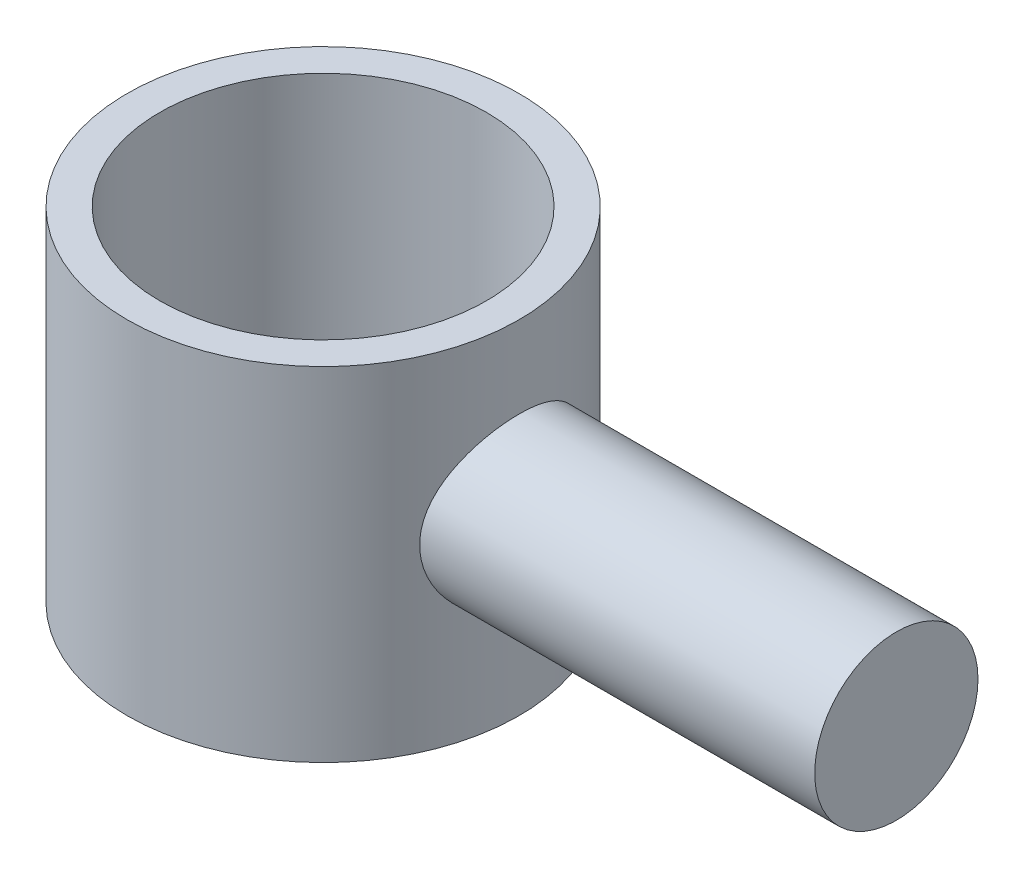
ISO-10303-21;
HEADER;
FILE_DESCRIPTION(('STEP AP214'),'2;1');
FILE_NAME('part.step','',(''),(''),'','','');
FILE_SCHEMA(('AUTOMOTIVE_DESIGN { 1 0 10303 214 1 1 1 1 }'));
ENDSEC;
DATA;
#1=APPLICATION_CONTEXT('core data for automotive mechanical design processes');
#2=APPLICATION_PROTOCOL_DEFINITION('international standard','automotive_design',2000,#1);
#3=PRODUCT_CONTEXT('',#1,'mechanical');
#4=PRODUCT('Part','Part','',(#3));
#5=PRODUCT_RELATED_PRODUCT_CATEGORY('part','',(#4));
#6=PRODUCT_DEFINITION_FORMATION('','',#4);
#7=PRODUCT_DEFINITION_CONTEXT('part definition',#1,'design');
#8=PRODUCT_DEFINITION('design','',#6,#7);
#9=PRODUCT_DEFINITION_SHAPE('','',#8);
#10=(LENGTH_UNIT() NAMED_UNIT(*) SI_UNIT(.MILLI.,.METRE.));
#11=(NAMED_UNIT(*) PLANE_ANGLE_UNIT() SI_UNIT($,.RADIAN.));
#12=(NAMED_UNIT(*) SI_UNIT($,.STERADIAN.) SOLID_ANGLE_UNIT());
#13=UNCERTAINTY_MEASURE_WITH_UNIT(LENGTH_MEASURE(1.E-05),#10,'distance_accuracy_value','');
#14=(GEOMETRIC_REPRESENTATION_CONTEXT(3) GLOBAL_UNCERTAINTY_ASSIGNED_CONTEXT((#13)) GLOBAL_UNIT_ASSIGNED_CONTEXT((#10,
#11,#12)) REPRESENTATION_CONTEXT('',''));
#15=CARTESIAN_POINT('',(0.,0.,0.));
#16=DIRECTION('',(0.,0.,1.));
#17=DIRECTION('',(1.,0.,0.));
#18=AXIS2_PLACEMENT_3D('',#15,#16,#17);
#19=CARTESIAN_POINT('',(0.,210.,0.));
#20=DIRECTION('',(0.,1.,0.));
#21=DIRECTION('',(0.,0.,1.));
#22=AXIS2_PLACEMENT_3D('',#19,#20,#21);
#23=PLANE('',#22);
#24=CARTESIAN_POINT('',(0.,210.,0.));
#25=DIRECTION('',(0.,1.,0.));
#26=DIRECTION('',(0.,0.,1.));
#27=AXIS2_PLACEMENT_3D('',#24,#25,#26);
#28=CIRCLE('',#27,120.);
#29=CARTESIAN_POINT('',(0.,210.,120.));
#30=VERTEX_POINT('',#29);
#31=EDGE_CURVE('E10',#30,#30,#28,.T.);
#32=ORIENTED_EDGE('',*,*,#31,.T.);
#33=EDGE_LOOP('',(#32));
#34=FACE_BOUND('',#33,.T.);
#35=CARTESIAN_POINT('',(0.,210.,0.));
#36=DIRECTION('',(0.,1.,0.));
#37=DIRECTION('',(0.,0.,1.));
#38=AXIS2_PLACEMENT_3D('',#35,#36,#37);
#39=CIRCLE('',#38,100.);
#40=CARTESIAN_POINT('',(0.,210.,100.));
#41=VERTEX_POINT('',#40);
#42=EDGE_CURVE('E42',#41,#41,#39,.T.);
#43=ORIENTED_EDGE('',*,*,#42,.F.);
#44=EDGE_LOOP('',(#43));
#45=FACE_BOUND('',#44,.T.);
#46=ADVANCED_FACE('F31',(#34,#45),#23,.T.);
#47=CARTESIAN_POINT('',(0.,0.,0.));
#48=DIRECTION('',(0.,1.,0.));
#49=DIRECTION('',(0.,0.,1.));
#50=AXIS2_PLACEMENT_3D('',#47,#48,#49);
#51=PLANE('',#50);
#52=CARTESIAN_POINT('',(0.,0.,0.));
#53=DIRECTION('',(0.,1.,0.));
#54=DIRECTION('',(0.,0.,1.));
#55=AXIS2_PLACEMENT_3D('',#52,#53,#54);
#56=CIRCLE('',#55,120.);
#57=CARTESIAN_POINT('',(0.,0.,120.));
#58=VERTEX_POINT('',#57);
#59=EDGE_CURVE('E35',#58,#58,#56,.T.);
#60=ORIENTED_EDGE('',*,*,#59,.F.);
#61=EDGE_LOOP('',(#60));
#62=FACE_BOUND('',#61,.T.);
#63=CARTESIAN_POINT('',(0.,0.,0.));
#64=DIRECTION('',(0.,1.,0.));
#65=DIRECTION('',(0.,0.,1.));
#66=AXIS2_PLACEMENT_3D('',#63,#64,#65);
#67=CIRCLE('',#66,100.);
#68=CARTESIAN_POINT('',(0.,0.,100.));
#69=VERTEX_POINT('',#68);
#70=EDGE_CURVE('E44',#69,#69,#67,.T.);
#71=ORIENTED_EDGE('',*,*,#70,.T.);
#72=EDGE_LOOP('',(#71));
#73=FACE_BOUND('',#72,.T.);
#74=ADVANCED_FACE('F73',(#62,#73),#51,.F.);
#75=CARTESIAN_POINT('',(0.,210.,0.));
#76=DIRECTION('',(0.,-1.,0.));
#77=DIRECTION('',(0.,0.,-1.));
#78=AXIS2_PLACEMENT_3D('',#75,#76,#77);
#79=CYLINDRICAL_SURFACE('',#78,120.);
#80=CARTESIAN_POINT('',(109.087121146357,110.,-50.));
#81=CARTESIAN_POINT('',(109.087121769528,110.667082917127,-49.9999994006115));
#82=CARTESIAN_POINT('',(109.09324519041,111.33419491938,-49.9866456959213));
#83=CARTESIAN_POINT('',(109.117687498157,112.66719794343,-49.9332665097033));
#84=CARTESIAN_POINT('',(109.136008027321,113.333088788694,-49.8932374364281));
#85=CARTESIAN_POINT('',(109.184701284633,114.662667195908,-49.7865894408554));
#86=CARTESIAN_POINT('',(109.215080432607,115.326353394044,-49.7199563548768));
#87=CARTESIAN_POINT('',(109.287622123923,116.649915832098,-49.5602983560333));
#88=CARTESIAN_POINT('',(109.329785823572,117.309791691655,-49.4672708533208));
#89=CARTESIAN_POINT('',(109.473668018017,119.284871583528,-49.1484655385415));
#90=CARTESIAN_POINT('',(109.592671212671,120.592682865512,-48.8831938995374));
#91=CARTESIAN_POINT('',(109.872736811669,123.178419739598,-48.2503980287102));
#92=CARTESIAN_POINT('',(110.033792729632,124.456349907592,-47.8828895657332));
#93=CARTESIAN_POINT('',(110.302642601984,126.341932503159,-47.2586257147939));
#94=CARTESIAN_POINT('',(110.396596134671,126.96407061308,-47.0388649108351));
#95=CARTESIAN_POINT('',(110.592932415297,128.198007379557,-46.5753875898117));
#96=CARTESIAN_POINT('',(110.695314706099,128.809806594683,-46.3316723717859));
#97=CARTESIAN_POINT('',(110.907754443794,130.022142321009,-45.8208085682801));
#98=CARTESIAN_POINT('',(111.017811508094,130.622679391746,-45.5536611507408));
#99=CARTESIAN_POINT('',(111.244835501407,131.811790744278,-44.9964119819212));
#100=CARTESIAN_POINT('',(111.361803855889,132.400362524322,-44.7063054910614));
#101=CARTESIAN_POINT('',(111.721724726272,134.14621390764,-43.8027019897478));
#102=CARTESIAN_POINT('',(111.973834408944,135.284426399529,-43.1555846714791));
#103=CARTESIAN_POINT('',(112.495747715835,137.50376640175,-41.7761920720391));
#104=CARTESIAN_POINT('',(112.765552414296,138.584890439107,-41.0439116186282));
#105=CARTESIAN_POINT('',(113.186184657094,140.189386164944,-39.8632083841146));
#106=CARTESIAN_POINT('',(113.333113731648,140.735338779977,-39.4437875879487));
#107=CARTESIAN_POINT('',(113.628986027598,141.809003307401,-38.5831646328386));
#108=CARTESIAN_POINT('',(113.777928770647,142.336719449517,-38.1419675830619));
#109=CARTESIAN_POINT('',(114.226378322529,143.891751467901,-36.7864112913372));
#110=CARTESIAN_POINT('',(114.527522313782,144.891010774006,-35.8400428520047));
#111=CARTESIAN_POINT('',(115.126303631339,146.808917898417,-33.8673472079906));
#112=CARTESIAN_POINT('',(115.423939618339,147.727535740371,-32.8409905351638));
#113=CARTESIAN_POINT('',(116.008038807986,149.478426712813,-30.7140199806887));
#114=CARTESIAN_POINT('',(116.294501820334,150.310698373052,-29.61340483514));
#115=CARTESIAN_POINT('',(116.861000337347,151.917576754926,-27.2945415496215));
#116=CARTESIAN_POINT('',(117.140214753528,152.688102541377,-26.0732594100613));
#117=CARTESIAN_POINT('',(117.670672213187,154.122914260075,-23.5638976589295));
#118=CARTESIAN_POINT('',(117.921914212891,154.787196228304,-22.2758155573863));
#119=CARTESIAN_POINT('',(118.389116558075,156.003239743665,-19.6419221722076));
#120=CARTESIAN_POINT('',(118.605089094586,156.555040186931,-18.296131039877));
#121=CARTESIAN_POINT('',(118.995456182529,157.540757359729,-15.5562083787796));
#122=CARTESIAN_POINT('',(119.169853644244,157.97468234092,-14.1620802414654));
#123=CARTESIAN_POINT('',(119.463913670798,158.700419050197,-11.4099852775746));
#124=CARTESIAN_POINT('',(119.585951989266,158.998450275148,-10.0539110870166));
#125=CARTESIAN_POINT('',(119.784477516877,159.481002007775,-7.31840821908095));
#126=CARTESIAN_POINT('',(119.860966171812,159.665526118288,-5.9389802844042));
#127=CARTESIAN_POINT('',(119.966178251465,159.918906408815,-3.16820361222309));
#128=CARTESIAN_POINT('',(119.994918152034,159.987802486715,-1.77685915318786));
#129=CARTESIAN_POINT('',(120.003846629651,160.009232952984,1.00685701848677));
#130=CARTESIAN_POINT('',(119.984037087776,159.961771849679,2.3992286892366));
#131=CARTESIAN_POINT('',(119.89912925188,159.757501939605,5.08900073600678));
#132=CARTESIAN_POINT('',(119.836864836411,159.607534040523,6.38701718367507));
#133=CARTESIAN_POINT('',(119.671638755241,159.207056444437,8.9647484248935));
#134=CARTESIAN_POINT('',(119.568679062838,158.956551622421,10.2444641027237));
#135=CARTESIAN_POINT('',(119.324627217543,158.357433934823,12.7770088104346));
#136=CARTESIAN_POINT('',(119.183533730254,158.008817636057,14.0298368977948));
#137=CARTESIAN_POINT('',(118.866655590133,157.216665484081,16.5005965178014));
#138=CARTESIAN_POINT('',(118.690869907844,156.773126814109,17.7185270136676));
#139=CARTESIAN_POINT('',(118.305877393294,155.787438637813,20.1304110467038));
#140=CARTESIAN_POINT('',(118.09620305675,155.243892369262,21.323718490677));
#141=CARTESIAN_POINT('',(117.650395909933,154.067131162857,23.6600683179743));
#142=CARTESIAN_POINT('',(117.414263034049,153.433916002645,24.8031105766428));
#143=CARTESIAN_POINT('',(116.92096708355,152.082164789256,27.0331694436863));
#144=CARTESIAN_POINT('',(116.663798156783,151.363604968205,28.120170323503));
#145=CARTESIAN_POINT('',(116.134309222195,149.845746705242,30.2325605530462));
#146=CARTESIAN_POINT('',(115.861988540637,149.04644467177,31.2579471588185));
#147=CARTESIAN_POINT('',(115.437089677084,147.761097522874,32.7808274312132));
#148=CARTESIAN_POINT('',(115.287661829708,147.30204968881,33.3022426910627));
#149=CARTESIAN_POINT('',(114.987220509682,146.362877083827,34.3252558845501));
#150=CARTESIAN_POINT('',(114.836207122697,145.882753447198,34.8268548819355));
#151=CARTESIAN_POINT('',(114.533589887552,144.902158649407,35.8095112439988));
#152=CARTESIAN_POINT('',(114.38198607131,144.401688574689,36.2905697026819));
#153=CARTESIAN_POINT('',(114.079153128978,143.38099449936,37.2315893744054));
#154=CARTESIAN_POINT('',(113.927924105653,142.860765608137,37.6915453012193));
#155=CARTESIAN_POINT('',(113.476294290158,141.271414427361,39.0387975803172));
#156=CARTESIAN_POINT('',(113.177969303577,140.173687121626,39.8934188193535));
#157=CARTESIAN_POINT('',(112.595198227224,137.90835121015,41.5097557086326));
#158=CARTESIAN_POINT('',(112.310751825223,136.740744177823,42.2714734495224));
#159=CARTESIAN_POINT('',(111.89616170449,134.92218186826,43.3520982886109));
#160=CARTESIAN_POINT('',(111.757886403629,134.294268463083,43.707089161853));
#161=CARTESIAN_POINT('',(111.488361376018,133.022611693511,44.3900892965016));
#162=CARTESIAN_POINT('',(111.357109986666,132.378872128385,44.7181049530595));
#163=CARTESIAN_POINT('',(111.102682074021,131.076381681106,45.3465435853707));
#164=CARTESIAN_POINT('',(110.979506616202,130.417628833609,45.6469629223769));
#165=CARTESIAN_POINT('',(110.742303924656,129.086311090848,46.2194549378673));
#166=CARTESIAN_POINT('',(110.628277247555,128.41374535831,46.4915258918943));
#167=CARTESIAN_POINT('',(110.301607799027,126.377913059927,47.2638198879434));
#168=CARTESIAN_POINT('',(110.1041515029,124.995378601925,47.720671187167));
#169=CARTESIAN_POINT('',(109.757311414267,122.190332273652,48.5130917244921));
#170=CARTESIAN_POINT('',(109.607923342925,120.767823973954,48.8486717579943));
#171=CARTESIAN_POINT('',(109.370974289154,117.987608202323,49.3767973601833));
#172=CARTESIAN_POINT('',(109.280030760112,116.631684496404,49.5772105065307));
#173=CARTESIAN_POINT('',(109.148523409333,113.905548366324,49.8660734477577));
#174=CARTESIAN_POINT('',(109.107957383908,112.535336569817,49.9545281400964));
#175=CARTESIAN_POINT('',(109.078699303147,109.792141981501,50.0183824093745));
#176=CARTESIAN_POINT('',(109.089991666683,108.419160145876,49.993815944115));
#177=CARTESIAN_POINT('',(109.16399975697,105.681282928765,49.832008510742));
#178=CARTESIAN_POINT('',(109.22671394721,104.316387306885,49.6947709093013));
#179=CARTESIAN_POINT('',(109.395655290867,101.692624987564,49.3216919740965));
#180=CARTESIAN_POINT('',(109.498833294051,100.432572996313,49.0927401811814));
#181=CARTESIAN_POINT('',(109.744987943453,97.9375136713739,48.5399738507507));
#182=CARTESIAN_POINT('',(109.887962529282,96.7025050446646,48.2161642242656));
#183=CARTESIAN_POINT('',(110.209496685317,94.2649002922232,47.4766173592912));
#184=CARTESIAN_POINT('',(110.388062243849,93.0623096596593,47.0608646497105));
#185=CARTESIAN_POINT('',(110.775722713844,90.6965565717083,46.1409605641787));
#186=CARTESIAN_POINT('',(110.984819061523,89.5333959743455,45.6368050293951));
#187=CARTESIAN_POINT('',(111.437389904751,87.2041345263877,44.5206215159839));
#188=CARTESIAN_POINT('',(111.681944701202,86.0399919037659,43.9049316783573));
#189=CARTESIAN_POINT('',(112.064044675229,84.3356851871716,42.9159028588744));
#190=CARTESIAN_POINT('',(112.193963380304,83.7745383565725,42.5752907759561));
#191=CARTESIAN_POINT('',(112.458087297168,82.6666726954793,41.872658437913));
#192=CARTESIAN_POINT('',(112.592293377426,82.1199568296772,41.5106338325587));
#193=CARTESIAN_POINT('',(113.000078391157,80.5024313190313,40.39320579798));
#194=CARTESIAN_POINT('',(113.278805991703,79.4543236455156,39.6064945479185));
#195=CARTESIAN_POINT('',(113.843037074605,77.424114287287,37.9542455349877));
#196=CARTESIAN_POINT('',(114.128540854264,76.442015505968,37.0887043087289));
#197=CARTESIAN_POINT('',(114.568397194061,74.9834909431515,35.6979645360249));
#198=CARTESIAN_POINT('',(114.72278778284,74.4819015249335,35.1989370316959));
#199=CARTESIAN_POINT('',(115.030476598339,73.5003055775859,34.1800043422734));
#200=CARTESIAN_POINT('',(115.18377505945,73.0202942922613,33.6601038062615));
#201=CARTESIAN_POINT('',(115.640560598636,71.6134605214889,32.0698689435435));
#202=CARTESIAN_POINT('',(115.940953531044,70.7197866107023,30.9689522454499));
#203=CARTESIAN_POINT('',(116.525237504847,69.0273008271619,28.6923419533714));
#204=CARTESIAN_POINT('',(116.809126809914,68.2284989265885,27.5166405185278));
#205=CARTESIAN_POINT('',(117.352716450828,66.7316936931903,25.0973420408124));
#206=CARTESIAN_POINT('',(117.612417320129,66.0336881372002,23.8537464962479));
#207=CARTESIAN_POINT('',(118.101094678816,64.7426617341391,21.3030943111943));
#208=CARTESIAN_POINT('',(118.329988008059,64.1499237165548,19.9958783793829));
#209=CARTESIAN_POINT('',(118.749711844389,63.0773212196564,17.3299292859631));
#210=CARTESIAN_POINT('',(118.940541914208,62.5974580370332,15.9711955327332));
#211=CARTESIAN_POINT('',(119.278439167909,61.7558852115497,13.2129962986292));
#212=CARTESIAN_POINT('',(119.425527749411,61.3941177896869,11.8135511021702));
#213=CARTESIAN_POINT('',(119.671605520577,60.7925950869024,8.98454645933553));
#214=CARTESIAN_POINT('',(119.770598315038,60.5528306617489,7.55498927824577));
#215=CARTESIAN_POINT('',(119.912303067009,60.2106166848534,4.77857658341683));
#216=CARTESIAN_POINT('',(119.95846726101,60.0997357029668,3.43293026241606));
#217=CARTESIAN_POINT('',(120.00531623021,59.9872151622465,0.736315786191869));
#218=CARTESIAN_POINT('',(120.006003247215,59.9855702185994,-0.614652103420484));
#219=CARTESIAN_POINT('',(119.961883715144,60.0915256345622,-3.31131616975797));
#220=CARTESIAN_POINT('',(119.917084372392,60.1991086893683,-4.65701314764314));
#221=CARTESIAN_POINT('',(119.783221512665,60.5223103307014,-7.3331227403345));
#222=CARTESIAN_POINT('',(119.694158273064,60.7379282402393,-8.66353545086451));
#223=CARTESIAN_POINT('',(119.478078862454,61.265341676775,-11.2523668158923));
#224=CARTESIAN_POINT('',(119.352524960854,61.5734443714485,-12.5116632328596));
#225=CARTESIAN_POINT('',(119.065550379158,62.2851043765701,-14.9987230087623));
#226=CARTESIAN_POINT('',(118.904130849659,62.6886586248852,-16.2264873778609));
#227=CARTESIAN_POINT('',(118.549243527199,63.5877850905551,-18.6431985621289));
#228=CARTESIAN_POINT('',(118.355771641403,64.0833690603678,-19.8321403967227));
#229=CARTESIAN_POINT('',(117.941273780556,65.1626025158838,-22.164363325333));
#230=CARTESIAN_POINT('',(117.720246674782,65.7462556156964,-23.307642543048));
#231=CARTESIAN_POINT('',(117.245128719137,67.0257195185825,-25.5930223092276));
#232=CARTESIAN_POINT('',(116.989995293924,67.7254058859422,-26.7327365206883));
#233=CARTESIAN_POINT('',(116.461238814735,69.2114933601797,-28.9495882616051));
#234=CARTESIAN_POINT('',(116.187615317912,69.9978965442571,-30.0267242911303));
#235=CARTESIAN_POINT('',(115.628314571642,71.6527234332939,-32.113235881776));
#236=CARTESIAN_POINT('',(115.342633620579,72.5211724289879,-33.1225903840388));
#237=CARTESIAN_POINT('',(114.766096662868,74.3349436663684,-35.0681146083282));
#238=CARTESIAN_POINT('',(114.475240471291,75.28026865942,-36.0042817086493));
#239=CARTESIAN_POINT('',(113.875601573912,77.309708973043,-37.8597627613475));
#240=CARTESIAN_POINT('',(113.566947343828,78.3988920481472,-38.7735848158936));
#241=CARTESIAN_POINT('',(112.960450441063,80.653081345769,-40.506539129794));
#242=CARTESIAN_POINT('',(112.662608423369,81.8180921499152,-41.3256656591814));
#243=CARTESIAN_POINT('',(112.086362796256,84.2180304491185,-42.8640007867394));
#244=CARTESIAN_POINT('',(111.807971463134,85.4530012248565,-43.5831465604503));
#245=CARTESIAN_POINT('',(111.279565571857,87.9846837521108,-44.9151631390584));
#246=CARTESIAN_POINT('',(111.029548957893,89.2813910210145,-45.5280416449404));
#247=CARTESIAN_POINT('',(110.567420828461,91.9214816809497,-46.6391053496666));
#248=CARTESIAN_POINT('',(110.355112992542,93.2645770629883,-47.1378887159703));
#249=CARTESIAN_POINT('',(110.069481299218,95.3116168061312,-47.7992313191377));
#250=CARTESIAN_POINT('',(109.979724164519,95.9995380554548,-48.0052472310993));
#251=CARTESIAN_POINT('',(109.811965142744,97.384927220857,-48.3877676166192));
#252=CARTESIAN_POINT('',(109.733961894731,98.0823940214758,-48.5642755070585));
#253=CARTESIAN_POINT('',(109.590658823319,99.4834967566776,-48.8867929696899));
#254=CARTESIAN_POINT('',(109.525323198401,100.187109253169,-49.032888582561));
#255=CARTESIAN_POINT('',(109.407713267703,101.600959045737,-49.294755260519));
#256=CARTESIAN_POINT('',(109.355437388297,102.311195532953,-49.4105299791837));
#257=CARTESIAN_POINT('',(109.264482827577,103.736402689496,-49.6113387408756));
#258=CARTESIAN_POINT('',(109.225795571723,104.451370082306,-49.6963921702666));
#259=CARTESIAN_POINT('',(109.162365536057,105.884836041829,-49.8355679629298));
#260=CARTESIAN_POINT('',(109.137620545192,106.603334030396,-49.8896952306894));
#261=CARTESIAN_POINT('',(109.109032584114,107.768490494724,-49.9521734470592));
#262=CARTESIAN_POINT('',(109.100818937984,108.214553873669,-49.9701058210024));
#263=CARTESIAN_POINT('',(109.089862985407,109.107073823184,-49.9940193530102));
#264=CARTESIAN_POINT('',(109.087120729277,109.553530397332,-50.0000004011626));
#265=CARTESIAN_POINT('',(109.087121146357,110.,-50.));
#266=B_SPLINE_CURVE_WITH_KNOTS('',3,(#80,#81,#82,#83,#84,#85,#86,#87,#88,#89,#90,#91,#92,#93,
#94,#95,#96,#97,#98,#99,#100,#101,#102,#103,#104,#105,#106,#107,#108,#109,#110,#111,#112,#113,
#114,#115,#116,#117,#118,#119,#120,#121,#122,#123,#124,#125,#126,#127,#128,#129,#130,#131,#132,
#133,#134,#135,#136,#137,#138,#139,#140,#141,#142,#143,#144,#145,#146,#147,#148,#149,#150,#151,
#152,#153,#154,#155,#156,#157,#158,#159,#160,#161,#162,#163,#164,#165,#166,#167,#168,#169,#170,
#171,#172,#173,#174,#175,#176,#177,#178,#179,#180,#181,#182,#183,#184,#185,#186,#187,#188,#189,
#190,#191,#192,#193,#194,#195,#196,#197,#198,#199,#200,#201,#202,#203,#204,#205,#206,#207,#208,
#209,#210,#211,#212,#213,#214,#215,#216,#217,#218,#219,#220,#221,#222,#223,#224,#225,#226,#227,
#228,#229,#230,#231,#232,#233,#234,#235,#236,#237,#238,#239,#240,#241,#242,#243,#244,#245,#246,
#247,#248,#249,#250,#251,#252,#253,#254,#255,#256,#257,#258,#259,#260,#261,#262,#263,#264,#265),
.UNSPECIFIED.,.T.,.F.,(4,2,2,2,2,2,2,2,2,2,2,2,2,2,2,2,2,2,2,2,2,2,2,2,2,2,2,2,2,2,2,2,2,2,2,2,
2,2,2,2,2,2,2,2,2,2,2,2,2,2,2,2,2,2,2,2,2,2,2,2,2,2,2,2,2,2,2,2,2,2,2,2,2,2,2,2,2,2,2,2,2,2,2,2,
2,2,2,2,2,2,2,2,4),(0.,2.00113630908032,4.0025421188008,6.00501487861172,8.00768419112523,
12.0215620901119,16.0348212378309,18.0337503186831,20.0325710581173,22.0312922260644,
24.030427083743,28.0260752818301,32.0219662757327,34.1333431529669,36.244226989916,
40.4657673947274,44.6888704597734,48.9120454213813,53.3188520006435,57.7258229620461,
62.1312673971556,66.5364033576002,70.7123386541798,74.8881413953007,79.0625029635909,
83.2367027963405,87.1564905227347,91.0760882034442,94.9958230584631,98.9156742452675,
102.895123410734,106.874582444518,110.855152339145,114.835899374844,116.967148924417,
119.098283911498,121.229305250722,123.360857532468,127.624220031205,131.887486571971,
134.090237598948,136.292464894013,138.494982150938,140.697633310806,145.099116129,
149.500207036693,153.615750874933,157.731114678495,161.845242080129,165.959246553946,
169.809360716923,173.659275584951,177.509838764568,181.360583139135,185.374269215541,
187.381328714017,189.388797382491,193.404016352103,197.419411815256,199.591429271708,
201.762965606545,206.105820300702,210.44913107746,214.792346043467,219.147059270264,
223.501822520981,227.854451975332,232.206755148213,236.254638927221,240.302323164802,
244.349366234788,248.396383944722,252.299485913523,256.202462685871,260.105938222675,
264.009573990718,268.089553087328,272.16962993628,276.250968603877,280.332453405505,
284.69196140457,289.051733056816,293.414231975585,297.776414620191,302.11517484899,
304.285635465152,306.455844578506,308.619827813173,310.78355017418,312.945904744403,
315.107916298027,316.447237532682,317.786571084571),.UNSPECIFIED.);
#267=CARTESIAN_POINT('',(109.087121146357,110.,-50.));
#268=VERTEX_POINT('',#267);
#269=EDGE_CURVE('E47',#268,#268,#266,.T.);
#270=ORIENTED_EDGE('',*,*,#269,.F.);
#271=EDGE_LOOP('',(#270));
#272=FACE_BOUND('',#271,.T.);
#273=ORIENTED_EDGE('',*,*,#31,.F.);
#274=EDGE_LOOP('',(#273));
#275=FACE_BOUND('',#274,.T.);
#276=ORIENTED_EDGE('',*,*,#59,.T.);
#277=EDGE_LOOP('',(#276));
#278=FACE_BOUND('',#277,.T.);
#279=ADVANCED_FACE('F33',(#272,#275,#278),#79,.T.);
#280=CARTESIAN_POINT('',(0.,210.,0.));
#281=DIRECTION('',(0.,-1.,0.));
#282=DIRECTION('',(0.,0.,-1.));
#283=AXIS2_PLACEMENT_3D('',#280,#281,#282);
#284=CYLINDRICAL_SURFACE('',#283,100.);
#285=ORIENTED_EDGE('',*,*,#42,.T.);
#286=EDGE_LOOP('',(#285));
#287=FACE_BOUND('',#286,.T.);
#288=ORIENTED_EDGE('',*,*,#70,.F.);
#289=EDGE_LOOP('',(#288));
#290=FACE_BOUND('',#289,.T.);
#291=ADVANCED_FACE('F69',(#287,#290),#284,.F.);
#292=CARTESIAN_POINT('',(-120.002,110.,0.));
#293=DIRECTION('',(1.,0.,0.));
#294=DIRECTION('',(0.,0.,-1.));
#295=AXIS2_PLACEMENT_3D('',#292,#293,#294);
#296=CYLINDRICAL_SURFACE('',#295,50.);
#297=ORIENTED_EDGE('',*,*,#269,.T.);
#298=EDGE_LOOP('',(#297));
#299=FACE_BOUND('',#298,.T.);
#300=CARTESIAN_POINT('',(351.,110.,0.));
#301=DIRECTION('',(1.,0.,0.));
#302=DIRECTION('',(0.,0.,-1.));
#303=AXIS2_PLACEMENT_3D('',#300,#301,#302);
#304=CIRCLE('',#303,50.);
#305=CARTESIAN_POINT('',(351.,110.,-50.));
#306=VERTEX_POINT('',#305);
#307=EDGE_CURVE('E57',#306,#306,#304,.T.);
#308=ORIENTED_EDGE('',*,*,#307,.F.);
#309=EDGE_LOOP('',(#308));
#310=FACE_BOUND('',#309,.T.);
#311=ADVANCED_FACE('F58',(#299,#310),#296,.T.);
#312=CARTESIAN_POINT('',(351.,110.,0.));
#313=DIRECTION('',(1.,0.,0.));
#314=DIRECTION('',(0.,0.,-1.));
#315=AXIS2_PLACEMENT_3D('',#312,#313,#314);
#316=PLANE('',#315);
#317=ORIENTED_EDGE('',*,*,#307,.T.);
#318=EDGE_LOOP('',(#317));
#319=FACE_BOUND('',#318,.T.);
#320=ADVANCED_FACE('F63',(#319),#316,.T.);
#321=CLOSED_SHELL('',(#46,#74,#279,#291,#311,#320));
#322=MANIFOLD_SOLID_BREP('B2',#321);
#323=ADVANCED_BREP_SHAPE_REPRESENTATION('',(#18,#322),#14);
#324=SHAPE_DEFINITION_REPRESENTATION(#9,#323);
ENDSEC;
END-ISO-10303-21;
